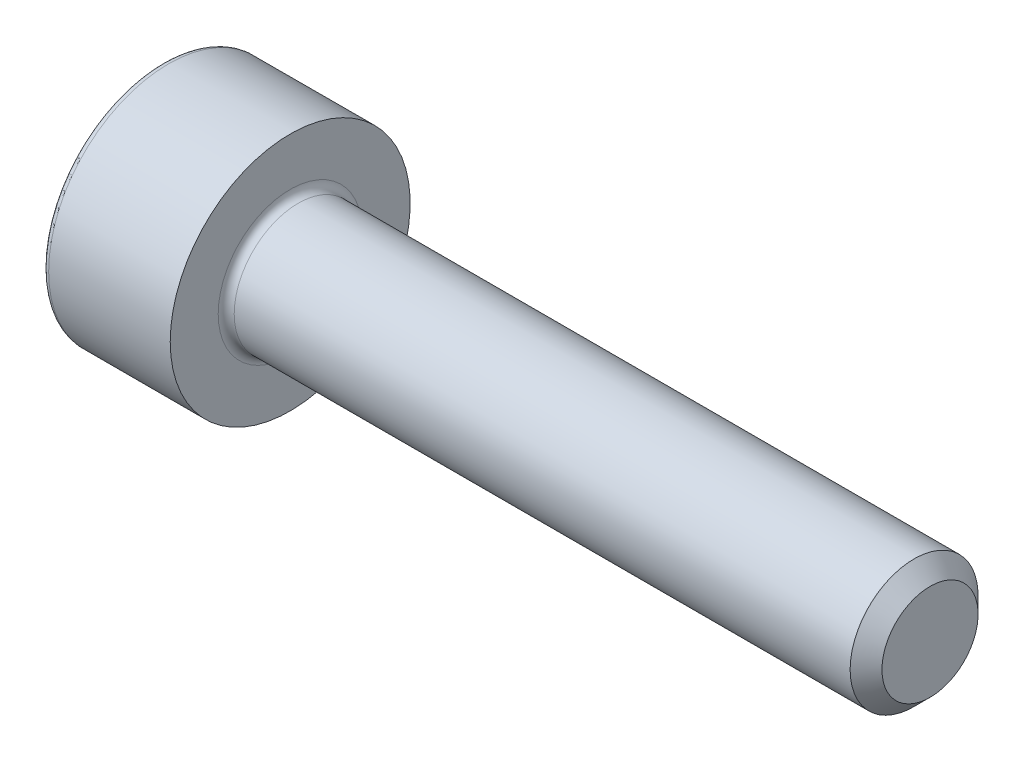
ISO-10303-21;
HEADER;
FILE_DESCRIPTION(('STEP AP214'),'2;1');
FILE_NAME('part.step','',(''),(''),'','','');
FILE_SCHEMA(('AUTOMOTIVE_DESIGN { 1 0 10303 214 1 1 1 1 }'));
ENDSEC;
DATA;
#1=APPLICATION_CONTEXT('core data for automotive mechanical design processes');
#2=APPLICATION_PROTOCOL_DEFINITION('international standard','automotive_design',2000,#1);
#3=PRODUCT_CONTEXT('',#1,'mechanical');
#4=PRODUCT('Part','Part','',(#3));
#5=PRODUCT_RELATED_PRODUCT_CATEGORY('part','',(#4));
#6=PRODUCT_DEFINITION_FORMATION('','',#4);
#7=PRODUCT_DEFINITION_CONTEXT('part definition',#1,'design');
#8=PRODUCT_DEFINITION('design','',#6,#7);
#9=PRODUCT_DEFINITION_SHAPE('','',#8);
#10=(LENGTH_UNIT() NAMED_UNIT(*) SI_UNIT(.MILLI.,.METRE.));
#11=(NAMED_UNIT(*) PLANE_ANGLE_UNIT() SI_UNIT($,.RADIAN.));
#12=(NAMED_UNIT(*) SI_UNIT($,.STERADIAN.) SOLID_ANGLE_UNIT());
#13=UNCERTAINTY_MEASURE_WITH_UNIT(LENGTH_MEASURE(1.E-05),#10,'distance_accuracy_value','');
#14=(GEOMETRIC_REPRESENTATION_CONTEXT(3) GLOBAL_UNCERTAINTY_ASSIGNED_CONTEXT((#13)) GLOBAL_UNIT_ASSIGNED_CONTEXT((#10,
#11,#12)) REPRESENTATION_CONTEXT('',''));
#15=CARTESIAN_POINT('',(0.,0.,0.));
#16=DIRECTION('',(0.,0.,1.));
#17=DIRECTION('',(1.,0.,0.));
#18=AXIS2_PLACEMENT_3D('',#15,#16,#17);
#19=CARTESIAN_POINT('',(-3.94962569274641,3.24759526419165,1.875));
#20=DIRECTION('',(1.,0.,0.));
#21=DIRECTION('',(0.,0.,-1.));
#22=AXIS2_PLACEMENT_3D('',#19,#20,#21);
#23=PLANE('',#22);
#24=CARTESIAN_POINT('',(-3.94962569274641,0.,0.));
#25=DIRECTION('',(1.,0.,0.));
#26=DIRECTION('',(0.,0.,-1.));
#27=AXIS2_PLACEMENT_3D('',#24,#25,#26);
#28=CIRCLE('',#27,1.875);
#29=CARTESIAN_POINT('',(-3.94962569274641,0.,-1.875));
#30=VERTEX_POINT('',#29);
#31=CARTESIAN_POINT('',(-3.94962569274641,-1.62379763209582,-0.9375));
#32=VERTEX_POINT('',#31);
#33=EDGE_CURVE('E11',#30,#32,#28,.F.);
#34=ORIENTED_EDGE('',*,*,#33,.F.);
#35=DIRECTION('',(0.,1.,0.));
#36=VECTOR('',#35,1.);
#37=CARTESIAN_POINT('',(-3.94962569274641,-1.08253175473055,-1.875));
#38=LINE('',#37,#36);
#39=CARTESIAN_POINT('',(-3.94962569274641,-1.08253175473055,-1.875));
#40=VERTEX_POINT('',#39);
#41=EDGE_CURVE('E179',#40,#30,#38,.T.);
#42=ORIENTED_EDGE('',*,*,#41,.F.);
#43=DIRECTION('',(0.,0.5,-0.866025403784439));
#44=VECTOR('',#43,1.);
#45=CARTESIAN_POINT('',(-3.94962569274641,-2.1650635094611,0.));
#46=LINE('',#45,#44);
#47=EDGE_CURVE('E175',#32,#40,#46,.T.);
#48=ORIENTED_EDGE('',*,*,#47,.F.);
#49=EDGE_LOOP('',(#34,#42,#48));
#50=FACE_BOUND('',#49,.T.);
#51=ADVANCED_FACE('F35',(#50),#23,.F.);
#52=CARTESIAN_POINT('',(-3.94962569274641,-1.62379763209582,0.9375));
#53=VERTEX_POINT('',#52);
#54=EDGE_CURVE('E44',#32,#53,#28,.F.);
#55=ORIENTED_EDGE('',*,*,#54,.F.);
#56=CARTESIAN_POINT('',(-3.94962569274641,-2.1650635094611,0.));
#57=VERTEX_POINT('',#56);
#58=EDGE_CURVE('E176',#57,#32,#46,.T.);
#59=ORIENTED_EDGE('',*,*,#58,.F.);
#60=DIRECTION('',(0.,-0.5,-0.866025403784438));
#61=VECTOR('',#60,1.);
#62=CARTESIAN_POINT('',(-3.94962569274641,-1.08253175473055,1.875));
#63=LINE('',#62,#61);
#64=EDGE_CURVE('E171',#53,#57,#63,.T.);
#65=ORIENTED_EDGE('',*,*,#64,.F.);
#66=EDGE_LOOP('',(#55,#59,#65));
#67=FACE_BOUND('',#66,.T.);
#68=ADVANCED_FACE('F119',(#67),#23,.F.);
#69=CARTESIAN_POINT('',(-3.94962569274641,0.,1.875));
#70=VERTEX_POINT('',#69);
#71=EDGE_CURVE('E255',#53,#70,#28,.F.);
#72=ORIENTED_EDGE('',*,*,#71,.F.);
#73=CARTESIAN_POINT('',(-3.94962569274641,-1.08253175473055,1.875));
#74=VERTEX_POINT('',#73);
#75=EDGE_CURVE('E172',#74,#53,#63,.T.);
#76=ORIENTED_EDGE('',*,*,#75,.F.);
#77=DIRECTION('',(0.,-1.,0.));
#78=VECTOR('',#77,1.);
#79=CARTESIAN_POINT('',(-3.94962569274641,1.08253175473055,1.875));
#80=LINE('',#79,#78);
#81=EDGE_CURVE('E167',#70,#74,#80,.T.);
#82=ORIENTED_EDGE('',*,*,#81,.F.);
#83=EDGE_LOOP('',(#72,#76,#82));
#84=FACE_BOUND('',#83,.T.);
#85=ADVANCED_FACE('F125',(#84),#23,.F.);
#86=CARTESIAN_POINT('',(-3.94962569274641,0.,0.));
#87=DIRECTION('',(-1.,0.,0.));
#88=DIRECTION('',(0.,0.,1.));
#89=AXIS2_PLACEMENT_3D('',#86,#87,#88);
#90=CIRCLE('',#89,1.875);
#91=CARTESIAN_POINT('',(-3.94962569274641,1.62379763209582,0.9375));
#92=VERTEX_POINT('',#91);
#93=EDGE_CURVE('E165',#70,#92,#90,.T.);
#94=ORIENTED_EDGE('',*,*,#93,.F.);
#95=CARTESIAN_POINT('',(-3.94962569274641,1.08253175473055,1.875));
#96=VERTEX_POINT('',#95);
#97=EDGE_CURVE('E168',#96,#70,#80,.T.);
#98=ORIENTED_EDGE('',*,*,#97,.F.);
#99=DIRECTION('',(0.,-0.5,0.866025403784439));
#100=VECTOR('',#99,1.);
#101=CARTESIAN_POINT('',(-3.94962569274641,2.1650635094611,0.));
#102=LINE('',#101,#100);
#103=EDGE_CURVE('E162',#92,#96,#102,.T.);
#104=ORIENTED_EDGE('',*,*,#103,.F.);
#105=EDGE_LOOP('',(#94,#98,#104));
#106=FACE_BOUND('',#105,.T.);
#107=ADVANCED_FACE('F139',(#106),#23,.F.);
#108=CARTESIAN_POINT('',(-3.94962569274641,1.62379763209582,-0.937500000000001));
#109=VERTEX_POINT('',#108);
#110=EDGE_CURVE('E51',#92,#109,#28,.F.);
#111=ORIENTED_EDGE('',*,*,#110,.F.);
#112=CARTESIAN_POINT('',(-3.94962569274641,2.1650635094611,0.));
#113=VERTEX_POINT('',#112);
#114=EDGE_CURVE('E153',#113,#92,#102,.T.);
#115=ORIENTED_EDGE('',*,*,#114,.F.);
#116=DIRECTION('',(0.,0.5,0.866025403784439));
#117=VECTOR('',#116,1.);
#118=CARTESIAN_POINT('',(-3.94962569274641,1.08253175473055,-1.875));
#119=LINE('',#118,#117);
#120=EDGE_CURVE('E150',#109,#113,#119,.T.);
#121=ORIENTED_EDGE('',*,*,#120,.F.);
#122=EDGE_LOOP('',(#111,#115,#121));
#123=FACE_BOUND('',#122,.T.);
#124=ADVANCED_FACE('F130',(#123),#23,.F.);
#125=EDGE_CURVE('E39',#109,#30,#28,.F.);
#126=ORIENTED_EDGE('',*,*,#125,.F.);
#127=CARTESIAN_POINT('',(-3.94962569274641,1.08253175473055,-1.875));
#128=VERTEX_POINT('',#127);
#129=EDGE_CURVE('E145',#128,#109,#119,.T.);
#130=ORIENTED_EDGE('',*,*,#129,.F.);
#131=EDGE_CURVE('E146',#30,#128,#38,.T.);
#132=ORIENTED_EDGE('',*,*,#131,.F.);
#133=EDGE_LOOP('',(#126,#130,#132));
#134=FACE_BOUND('',#133,.T.);
#135=ADVANCED_FACE('F121',(#134),#23,.F.);
#136=CARTESIAN_POINT('',(-5.69962569274641,0.,0.));
#137=DIRECTION('',(1.,0.,0.));
#138=DIRECTION('',(0.,0.,-1.));
#139=AXIS2_PLACEMENT_3D('',#136,#137,#138);
#140=PLANE('',#139);
#141=CARTESIAN_POINT('',(-5.69962569274641,0.,0.));
#142=DIRECTION('',(1.,0.,0.));
#143=DIRECTION('',(0.,0.,-1.));
#144=AXIS2_PLACEMENT_3D('',#141,#142,#143);
#145=CIRCLE('',#144,3.55);
#146=CARTESIAN_POINT('',(-5.69962569274641,0.,-3.55));
#147=VERTEX_POINT('',#146);
#148=EDGE_CURVE('E222',#147,#147,#145,.F.);
#149=ORIENTED_EDGE('',*,*,#148,.T.);
#150=EDGE_LOOP('',(#149));
#151=FACE_BOUND('',#150,.T.);
#152=DIRECTION('',(0.,0.5,0.866025403784439));
#153=VECTOR('',#152,1.);
#154=CARTESIAN_POINT('',(-5.69962569274641,1.08253175473055,-1.875));
#155=LINE('',#154,#153);
#156=CARTESIAN_POINT('',(-5.69962569274641,1.08253175473055,-1.875));
#157=VERTEX_POINT('',#156);
#158=CARTESIAN_POINT('',(-5.69962569274641,2.1650635094611,0.));
#159=VERTEX_POINT('',#158);
#160=EDGE_CURVE('E181',#157,#159,#155,.T.);
#161=ORIENTED_EDGE('',*,*,#160,.T.);
#162=DIRECTION('',(0.,-0.5,0.866025403784439));
#163=VECTOR('',#162,1.);
#164=CARTESIAN_POINT('',(-5.69962569274641,2.1650635094611,0.));
#165=LINE('',#164,#163);
#166=CARTESIAN_POINT('',(-5.69962569274641,1.08253175473055,1.875));
#167=VERTEX_POINT('',#166);
#168=EDGE_CURVE('E183',#159,#167,#165,.T.);
#169=ORIENTED_EDGE('',*,*,#168,.T.);
#170=DIRECTION('',(0.,-1.,0.));
#171=VECTOR('',#170,1.);
#172=CARTESIAN_POINT('',(-5.69962569274641,1.08253175473055,1.875));
#173=LINE('',#172,#171);
#174=CARTESIAN_POINT('',(-5.69962569274641,-1.08253175473055,1.875));
#175=VERTEX_POINT('',#174);
#176=EDGE_CURVE('E185',#167,#175,#173,.T.);
#177=ORIENTED_EDGE('',*,*,#176,.T.);
#178=DIRECTION('',(0.,-0.5,-0.866025403784438));
#179=VECTOR('',#178,1.);
#180=CARTESIAN_POINT('',(-5.69962569274641,-1.08253175473055,1.875));
#181=LINE('',#180,#179);
#182=CARTESIAN_POINT('',(-5.69962569274641,-2.1650635094611,0.));
#183=VERTEX_POINT('',#182);
#184=EDGE_CURVE('E187',#175,#183,#181,.T.);
#185=ORIENTED_EDGE('',*,*,#184,.T.);
#186=DIRECTION('',(0.,0.5,-0.866025403784439));
#187=VECTOR('',#186,1.);
#188=CARTESIAN_POINT('',(-5.69962569274641,-2.1650635094611,0.));
#189=LINE('',#188,#187);
#190=CARTESIAN_POINT('',(-5.69962569274641,-1.08253175473055,-1.875));
#191=VERTEX_POINT('',#190);
#192=EDGE_CURVE('E189',#183,#191,#189,.T.);
#193=ORIENTED_EDGE('',*,*,#192,.T.);
#194=DIRECTION('',(0.,1.,0.));
#195=VECTOR('',#194,1.);
#196=CARTESIAN_POINT('',(-5.69962569274641,-1.08253175473055,-1.875));
#197=LINE('',#196,#195);
#198=EDGE_CURVE('E59',#191,#157,#197,.T.);
#199=ORIENTED_EDGE('',*,*,#198,.T.);
#200=EDGE_LOOP('',(#161,#169,#177,#185,#193,#199));
#201=FACE_BOUND('',#200,.T.);
#202=ADVANCED_FACE('F129',(#151,#201),#140,.F.);
#203=CARTESIAN_POINT('',(-5.69962569274641,0.,0.));
#204=DIRECTION('',(-1.,0.,0.));
#205=DIRECTION('',(0.,0.,1.));
#206=AXIS2_PLACEMENT_3D('',#203,#204,#205);
#207=CYLINDRICAL_SURFACE('',#206,3.75);
#208=CARTESIAN_POINT('',(-5.49962569274641,0.,0.));
#209=DIRECTION('',(1.,0.,0.));
#210=DIRECTION('',(0.,0.,-1.));
#211=AXIS2_PLACEMENT_3D('',#208,#209,#210);
#212=CIRCLE('',#211,3.75);
#213=CARTESIAN_POINT('',(-5.49962569274641,0.,-3.75));
#214=VERTEX_POINT('',#213);
#215=EDGE_CURVE('E148',#214,#214,#212,.T.);
#216=ORIENTED_EDGE('',*,*,#215,.T.);
#217=EDGE_LOOP('',(#216));
#218=FACE_BOUND('',#217,.T.);
#219=CARTESIAN_POINT('',(-1.69962569274641,0.,0.));
#220=DIRECTION('',(-1.,0.,0.));
#221=DIRECTION('',(0.,0.,1.));
#222=AXIS2_PLACEMENT_3D('',#219,#220,#221);
#223=CIRCLE('',#222,3.75);
#224=CARTESIAN_POINT('',(-1.69962569274641,0.,3.75));
#225=VERTEX_POINT('',#224);
#226=EDGE_CURVE('E213',#225,#225,#223,.T.);
#227=ORIENTED_EDGE('',*,*,#226,.T.);
#228=EDGE_LOOP('',(#227));
#229=FACE_BOUND('',#228,.T.);
#230=ADVANCED_FACE('F136',(#218,#229),#207,.T.);
#231=CARTESIAN_POINT('',(-1.69962569274641,3.75,0.));
#232=DIRECTION('',(-1.,0.,0.));
#233=DIRECTION('',(0.,0.,1.));
#234=AXIS2_PLACEMENT_3D('',#231,#232,#233);
#235=PLANE('',#234);
#236=CARTESIAN_POINT('',(-1.69962569274641,0.,0.));
#237=DIRECTION('',(-1.,0.,0.));
#238=DIRECTION('',(0.,0.,1.));
#239=AXIS2_PLACEMENT_3D('',#236,#237,#238);
#240=CIRCLE('',#239,2.25);
#241=CARTESIAN_POINT('',(-1.69962569274641,0.,2.25));
#242=VERTEX_POINT('',#241);
#243=EDGE_CURVE('E216',#242,#242,#240,.T.);
#244=ORIENTED_EDGE('',*,*,#243,.T.);
#245=EDGE_LOOP('',(#244));
#246=FACE_BOUND('',#245,.T.);
#247=ORIENTED_EDGE('',*,*,#226,.F.);
#248=EDGE_LOOP('',(#247));
#249=FACE_BOUND('',#248,.T.);
#250=ADVANCED_FACE('F293',(#246,#249),#235,.F.);
#251=CARTESIAN_POINT('',(-5.69962569274641,0.,0.));
#252=DIRECTION('',(-1.,0.,0.));
#253=DIRECTION('',(0.,0.,1.));
#254=AXIS2_PLACEMENT_3D('',#251,#252,#253);
#255=CYLINDRICAL_SURFACE('',#254,2.);
#256=CARTESIAN_POINT('',(-1.44962569274641,0.,0.));
#257=DIRECTION('',(-1.,0.,0.));
#258=DIRECTION('',(0.,0.,1.));
#259=AXIS2_PLACEMENT_3D('',#256,#257,#258);
#260=CIRCLE('',#259,2.);
#261=CARTESIAN_POINT('',(-1.44962569274641,0.,2.));
#262=VERTEX_POINT('',#261);
#263=EDGE_CURVE('E219',#262,#262,#260,.F.);
#264=ORIENTED_EDGE('',*,*,#263,.T.);
#265=EDGE_LOOP('',(#264));
#266=FACE_BOUND('',#265,.T.);
#267=CARTESIAN_POINT('',(17.8028743072536,0.,0.));
#268=DIRECTION('',(-1.,0.,0.));
#269=DIRECTION('',(0.,0.,1.));
#270=AXIS2_PLACEMENT_3D('',#267,#268,#269);
#271=CIRCLE('',#270,2.);
#272=CARTESIAN_POINT('',(17.8028743072536,0.,2.));
#273=VERTEX_POINT('',#272);
#274=EDGE_CURVE('E210',#273,#273,#271,.T.);
#275=ORIENTED_EDGE('',*,*,#274,.T.);
#276=EDGE_LOOP('',(#275));
#277=FACE_BOUND('',#276,.T.);
#278=ADVANCED_FACE('F302',(#266,#277),#255,.T.);
#279=CARTESIAN_POINT('',(18.3003743072536,0.,0.));
#280=DIRECTION('',(-1.,0.,0.));
#281=DIRECTION('',(0.,0.,1.));
#282=AXIS2_PLACEMENT_3D('',#279,#280,#281);
#283=CONICAL_SURFACE('',#282,1.5025,0.785398163397445);
#284=ORIENTED_EDGE('',*,*,#274,.F.);
#285=EDGE_LOOP('',(#284));
#286=FACE_BOUND('',#285,.T.);
#287=CARTESIAN_POINT('',(18.3003743072536,0.,0.));
#288=DIRECTION('',(-1.,0.,0.));
#289=DIRECTION('',(0.,0.,1.));
#290=AXIS2_PLACEMENT_3D('',#287,#288,#289);
#291=CIRCLE('',#290,1.5025);
#292=CARTESIAN_POINT('',(18.3003743072536,0.,1.5025));
#293=VERTEX_POINT('',#292);
#294=EDGE_CURVE('E207',#293,#293,#291,.T.);
#295=ORIENTED_EDGE('',*,*,#294,.T.);
#296=EDGE_LOOP('',(#295));
#297=FACE_BOUND('',#296,.T.);
#298=ADVANCED_FACE('F312',(#286,#297),#283,.T.);
#299=CARTESIAN_POINT('',(18.3003743072536,1.5025,0.));
#300=DIRECTION('',(-1.,0.,0.));
#301=DIRECTION('',(0.,0.,1.));
#302=AXIS2_PLACEMENT_3D('',#299,#300,#301);
#303=PLANE('',#302);
#304=ORIENTED_EDGE('',*,*,#294,.F.);
#305=EDGE_LOOP('',(#304));
#306=FACE_BOUND('',#305,.T.);
#307=ADVANCED_FACE('F322',(#306),#303,.F.);
#308=CARTESIAN_POINT('',(-1.44962569274641,0.,0.));
#309=DIRECTION('',(-1.,0.,0.));
#310=DIRECTION('',(0.,0.,1.));
#311=AXIS2_PLACEMENT_3D('',#308,#309,#310);
#312=TOROIDAL_SURFACE('',#311,2.25,0.25);
#313=ORIENTED_EDGE('',*,*,#263,.F.);
#314=EDGE_LOOP('',(#313));
#315=FACE_BOUND('',#314,.T.);
#316=ORIENTED_EDGE('',*,*,#243,.F.);
#317=EDGE_LOOP('',(#316));
#318=FACE_BOUND('',#317,.T.);
#319=ADVANCED_FACE('F231',(#315,#318),#312,.F.);
#320=CARTESIAN_POINT('',(-5.49962569274641,0.,0.));
#321=DIRECTION('',(1.,0.,0.));
#322=DIRECTION('',(0.,0.,-1.));
#323=AXIS2_PLACEMENT_3D('',#320,#321,#322);
#324=TOROIDAL_SURFACE('',#323,3.55,0.2);
#325=ORIENTED_EDGE('',*,*,#215,.F.);
#326=EDGE_LOOP('',(#325));
#327=FACE_BOUND('',#326,.T.);
#328=ORIENTED_EDGE('',*,*,#148,.F.);
#329=EDGE_LOOP('',(#328));
#330=FACE_BOUND('',#329,.T.);
#331=ADVANCED_FACE('F37',(#327,#330),#324,.T.);
#332=CARTESIAN_POINT('',(-3.94962569274641,1.08253175473055,-1.875));
#333=DIRECTION('',(0.,-0.866025403784439,0.5));
#334=DIRECTION('',(0.,-0.5,-0.866025403784439));
#335=AXIS2_PLACEMENT_3D('',#332,#333,#334);
#336=PLANE('',#335);
#337=ORIENTED_EDGE('',*,*,#129,.T.);
#338=ORIENTED_EDGE('',*,*,#120,.T.);
#339=DIRECTION('',(-1.,0.,0.));
#340=VECTOR('',#339,1.);
#341=CARTESIAN_POINT('',(-3.94962569274641,2.1650635094611,0.));
#342=LINE('',#341,#340);
#343=EDGE_CURVE('E205',#113,#159,#342,.T.);
#344=ORIENTED_EDGE('',*,*,#343,.T.);
#345=ORIENTED_EDGE('',*,*,#160,.F.);
#346=DIRECTION('',(-1.,0.,0.));
#347=VECTOR('',#346,1.);
#348=CARTESIAN_POINT('',(-3.94962569274641,1.08253175473055,-1.875));
#349=LINE('',#348,#347);
#350=EDGE_CURVE('E161',#128,#157,#349,.T.);
#351=ORIENTED_EDGE('',*,*,#350,.F.);
#352=EDGE_LOOP('',(#337,#338,#344,#345,#351));
#353=FACE_BOUND('',#352,.T.);
#354=ADVANCED_FACE('F159',(#353),#336,.T.);
#355=CARTESIAN_POINT('',(-3.94962569274641,2.1650635094611,0.));
#356=DIRECTION('',(0.,-0.866025403784439,-0.5));
#357=DIRECTION('',(0.,0.5,-0.866025403784439));
#358=AXIS2_PLACEMENT_3D('',#355,#356,#357);
#359=PLANE('',#358);
#360=ORIENTED_EDGE('',*,*,#114,.T.);
#361=ORIENTED_EDGE('',*,*,#103,.T.);
#362=DIRECTION('',(-1.,0.,0.));
#363=VECTOR('',#362,1.);
#364=CARTESIAN_POINT('',(-3.94962569274641,1.08253175473055,1.875));
#365=LINE('',#364,#363);
#366=EDGE_CURVE('E202',#96,#167,#365,.T.);
#367=ORIENTED_EDGE('',*,*,#366,.T.);
#368=ORIENTED_EDGE('',*,*,#168,.F.);
#369=ORIENTED_EDGE('',*,*,#343,.F.);
#370=EDGE_LOOP('',(#360,#361,#367,#368,#369));
#371=FACE_BOUND('',#370,.T.);
#372=ADVANCED_FACE('F235',(#371),#359,.T.);
#373=CARTESIAN_POINT('',(-3.94962569274641,1.08253175473055,1.875));
#374=DIRECTION('',(0.,0.,-1.));
#375=DIRECTION('',(-1.,0.,0.));
#376=AXIS2_PLACEMENT_3D('',#373,#374,#375);
#377=PLANE('',#376);
#378=ORIENTED_EDGE('',*,*,#97,.T.);
#379=ORIENTED_EDGE('',*,*,#81,.T.);
#380=DIRECTION('',(-1.,0.,0.));
#381=VECTOR('',#380,1.);
#382=CARTESIAN_POINT('',(-3.94962569274641,-1.08253175473055,1.875));
#383=LINE('',#382,#381);
#384=EDGE_CURVE('E199',#74,#175,#383,.T.);
#385=ORIENTED_EDGE('',*,*,#384,.T.);
#386=ORIENTED_EDGE('',*,*,#176,.F.);
#387=ORIENTED_EDGE('',*,*,#366,.F.);
#388=EDGE_LOOP('',(#378,#379,#385,#386,#387));
#389=FACE_BOUND('',#388,.T.);
#390=ADVANCED_FACE('F240',(#389),#377,.T.);
#391=CARTESIAN_POINT('',(-3.94962569274641,-1.08253175473055,1.875));
#392=DIRECTION('',(0.,0.866025403784439,-0.5));
#393=DIRECTION('',(0.,0.5,0.866025403784439));
#394=AXIS2_PLACEMENT_3D('',#391,#392,#393);
#395=PLANE('',#394);
#396=ORIENTED_EDGE('',*,*,#75,.T.);
#397=ORIENTED_EDGE('',*,*,#64,.T.);
#398=DIRECTION('',(-1.,0.,0.));
#399=VECTOR('',#398,1.);
#400=CARTESIAN_POINT('',(-3.94962569274641,-2.1650635094611,0.));
#401=LINE('',#400,#399);
#402=EDGE_CURVE('E196',#57,#183,#401,.T.);
#403=ORIENTED_EDGE('',*,*,#402,.T.);
#404=ORIENTED_EDGE('',*,*,#184,.F.);
#405=ORIENTED_EDGE('',*,*,#384,.F.);
#406=EDGE_LOOP('',(#396,#397,#403,#404,#405));
#407=FACE_BOUND('',#406,.T.);
#408=ADVANCED_FACE('F246',(#407),#395,.T.);
#409=CARTESIAN_POINT('',(-3.94962569274641,-2.1650635094611,0.));
#410=DIRECTION('',(0.,0.866025403784439,0.5));
#411=DIRECTION('',(0.,-0.5,0.866025403784439));
#412=AXIS2_PLACEMENT_3D('',#409,#410,#411);
#413=PLANE('',#412);
#414=ORIENTED_EDGE('',*,*,#58,.T.);
#415=ORIENTED_EDGE('',*,*,#47,.T.);
#416=DIRECTION('',(-1.,0.,0.));
#417=VECTOR('',#416,1.);
#418=CARTESIAN_POINT('',(-3.94962569274641,-1.08253175473055,-1.875));
#419=LINE('',#418,#417);
#420=EDGE_CURVE('E193',#40,#191,#419,.T.);
#421=ORIENTED_EDGE('',*,*,#420,.T.);
#422=ORIENTED_EDGE('',*,*,#192,.F.);
#423=ORIENTED_EDGE('',*,*,#402,.F.);
#424=EDGE_LOOP('',(#414,#415,#421,#422,#423));
#425=FACE_BOUND('',#424,.T.);
#426=ADVANCED_FACE('F114',(#425),#413,.T.);
#427=CARTESIAN_POINT('',(-3.94962569274641,-1.08253175473055,-1.875));
#428=DIRECTION('',(0.,0.,1.));
#429=DIRECTION('',(1.,0.,0.));
#430=AXIS2_PLACEMENT_3D('',#427,#428,#429);
#431=PLANE('',#430);
#432=ORIENTED_EDGE('',*,*,#41,.T.);
#433=ORIENTED_EDGE('',*,*,#131,.T.);
#434=ORIENTED_EDGE('',*,*,#350,.T.);
#435=ORIENTED_EDGE('',*,*,#198,.F.);
#436=ORIENTED_EDGE('',*,*,#420,.F.);
#437=EDGE_LOOP('',(#432,#433,#434,#435,#436));
#438=FACE_BOUND('',#437,.T.);
#439=ADVANCED_FACE('F109',(#438),#431,.T.);
#440=CARTESIAN_POINT('',(-2.86709393801585,0.,0.));
#441=DIRECTION('',(-1.,0.,0.));
#442=DIRECTION('',(0.,0.,1.));
#443=AXIS2_PLACEMENT_3D('',#440,#441,#442);
#444=CONICAL_SURFACE('',#443,0.,1.04719755119659);
#445=ORIENTED_EDGE('',*,*,#93,.T.);
#446=ORIENTED_EDGE('',*,*,#110,.T.);
#447=ORIENTED_EDGE('',*,*,#125,.T.);
#448=ORIENTED_EDGE('',*,*,#33,.T.);
#449=ORIENTED_EDGE('',*,*,#54,.T.);
#450=ORIENTED_EDGE('',*,*,#71,.T.);
#451=EDGE_LOOP('',(#445,#446,#447,#448,#449,#450));
#452=FACE_BOUND('',#451,.T.);
#453=CARTESIAN_POINT('',(-2.86709393801585,0.,0.));
#454=VERTEX_POINT('',#453);
#455=VERTEX_LOOP('',#454);
#456=FACE_BOUND('',#455,.T.);
#457=ADVANCED_FACE('F107',(#452,#456),#444,.F.);
#458=CLOSED_SHELL('',(#51,#68,#85,#107,#124,#135,#202,#230,#250,#278,#298,#307,#319,#331,#354,
#372,#390,#408,#426,#439,#457));
#459=MANIFOLD_SOLID_BREP('B2',#458);
#460=ADVANCED_BREP_SHAPE_REPRESENTATION('',(#18,#459),#14);
#461=SHAPE_DEFINITION_REPRESENTATION(#9,#460);
ENDSEC;
END-ISO-10303-21;
